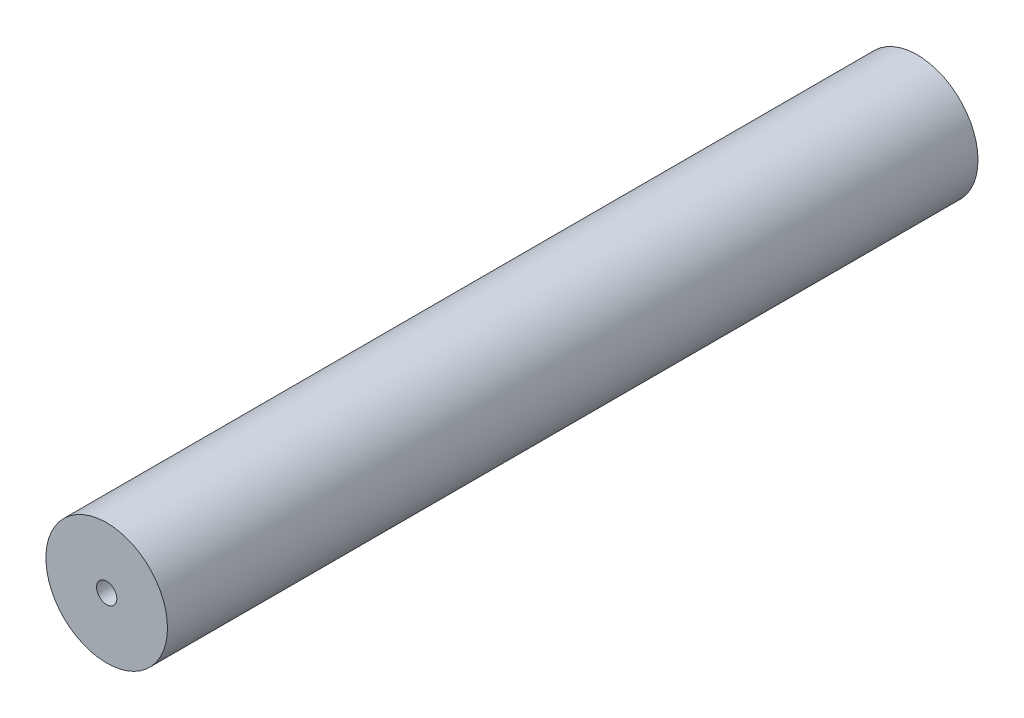
ISO-10303-21;
HEADER;
FILE_DESCRIPTION(('STEP AP214'),'2;1');
FILE_NAME('part.step','',(''),(''),'','','');
FILE_SCHEMA(('AUTOMOTIVE_DESIGN { 1 0 10303 214 1 1 1 1 }'));
ENDSEC;
DATA;
#1=APPLICATION_CONTEXT('core data for automotive mechanical design processes');
#2=APPLICATION_PROTOCOL_DEFINITION('international standard','automotive_design',2000,#1);
#3=PRODUCT_CONTEXT('',#1,'mechanical');
#4=PRODUCT('Part','Part','',(#3));
#5=PRODUCT_RELATED_PRODUCT_CATEGORY('part','',(#4));
#6=PRODUCT_DEFINITION_FORMATION('','',#4);
#7=PRODUCT_DEFINITION_CONTEXT('part definition',#1,'design');
#8=PRODUCT_DEFINITION('design','',#6,#7);
#9=PRODUCT_DEFINITION_SHAPE('','',#8);
#10=(LENGTH_UNIT() NAMED_UNIT(*) SI_UNIT(.MILLI.,.METRE.));
#11=(NAMED_UNIT(*) PLANE_ANGLE_UNIT() SI_UNIT($,.RADIAN.));
#12=(NAMED_UNIT(*) SI_UNIT($,.STERADIAN.) SOLID_ANGLE_UNIT());
#13=UNCERTAINTY_MEASURE_WITH_UNIT(LENGTH_MEASURE(1.E-05),#10,'distance_accuracy_value','');
#14=(GEOMETRIC_REPRESENTATION_CONTEXT(3) GLOBAL_UNCERTAINTY_ASSIGNED_CONTEXT((#13)) GLOBAL_UNIT_ASSIGNED_CONTEXT((#10,
#11,#12)) REPRESENTATION_CONTEXT('',''));
#15=CARTESIAN_POINT('',(0.,0.,0.));
#16=DIRECTION('',(0.,0.,1.));
#17=DIRECTION('',(1.,0.,0.));
#18=AXIS2_PLACEMENT_3D('',#15,#16,#17);
#19=CARTESIAN_POINT('',(0.,0.,508.));
#20=DIRECTION('',(0.,0.,1.));
#21=DIRECTION('',(1.,0.,0.));
#22=AXIS2_PLACEMENT_3D('',#19,#20,#21);
#23=PLANE('',#22);
#24=CARTESIAN_POINT('',(0.,0.,508.));
#25=DIRECTION('',(0.,0.,1.));
#26=DIRECTION('',(1.,0.,0.));
#27=AXIS2_PLACEMENT_3D('',#24,#25,#26);
#28=CIRCLE('',#27,38.1);
#29=CARTESIAN_POINT('',(38.1,0.,508.));
#30=VERTEX_POINT('',#29);
#31=EDGE_CURVE('E10',#30,#30,#28,.T.);
#32=ORIENTED_EDGE('',*,*,#31,.T.);
#33=EDGE_LOOP('',(#32));
#34=FACE_BOUND('',#33,.T.);
#35=CARTESIAN_POINT('',(0.,0.,508.));
#36=DIRECTION('',(0.,0.,1.));
#37=DIRECTION('',(1.,0.,0.));
#38=AXIS2_PLACEMENT_3D('',#35,#36,#37);
#39=CIRCLE('',#38,6.35);
#40=CARTESIAN_POINT('',(6.35,0.,508.));
#41=VERTEX_POINT('',#40);
#42=EDGE_CURVE('E50',#41,#41,#39,.T.);
#43=ORIENTED_EDGE('',*,*,#42,.F.);
#44=EDGE_LOOP('',(#43));
#45=FACE_BOUND('',#44,.T.);
#46=ADVANCED_FACE('F39',(#34,#45),#23,.T.);
#47=CARTESIAN_POINT('',(0.,0.,0.));
#48=DIRECTION('',(0.,0.,1.));
#49=DIRECTION('',(1.,0.,0.));
#50=AXIS2_PLACEMENT_3D('',#47,#48,#49);
#51=PLANE('',#50);
#52=CARTESIAN_POINT('',(0.,0.,0.));
#53=DIRECTION('',(0.,0.,1.));
#54=DIRECTION('',(1.,0.,0.));
#55=AXIS2_PLACEMENT_3D('',#52,#53,#54);
#56=CIRCLE('',#55,38.1);
#57=CARTESIAN_POINT('',(38.1,0.,0.));
#58=VERTEX_POINT('',#57);
#59=EDGE_CURVE('E43',#58,#58,#56,.T.);
#60=ORIENTED_EDGE('',*,*,#59,.F.);
#61=EDGE_LOOP('',(#60));
#62=FACE_BOUND('',#61,.T.);
#63=CARTESIAN_POINT('',(0.,0.,0.));
#64=DIRECTION('',(0.,0.,1.));
#65=DIRECTION('',(1.,0.,0.));
#66=AXIS2_PLACEMENT_3D('',#63,#64,#65);
#67=CIRCLE('',#66,6.35);
#68=CARTESIAN_POINT('',(6.35,0.,0.));
#69=VERTEX_POINT('',#68);
#70=EDGE_CURVE('E52',#69,#69,#67,.T.);
#71=ORIENTED_EDGE('',*,*,#70,.T.);
#72=EDGE_LOOP('',(#71));
#73=FACE_BOUND('',#72,.T.);
#74=ADVANCED_FACE('F62',(#62,#73),#51,.F.);
#75=CARTESIAN_POINT('',(0.,0.,508.));
#76=DIRECTION('',(0.,0.,-1.));
#77=DIRECTION('',(-1.,0.,0.));
#78=AXIS2_PLACEMENT_3D('',#75,#76,#77);
#79=CYLINDRICAL_SURFACE('',#78,38.1);
#80=ORIENTED_EDGE('',*,*,#31,.F.);
#81=EDGE_LOOP('',(#80));
#82=FACE_BOUND('',#81,.T.);
#83=ORIENTED_EDGE('',*,*,#59,.T.);
#84=EDGE_LOOP('',(#83));
#85=FACE_BOUND('',#84,.T.);
#86=ADVANCED_FACE('F41',(#82,#85),#79,.T.);
#87=CARTESIAN_POINT('',(0.,0.,508.));
#88=DIRECTION('',(0.,0.,-1.));
#89=DIRECTION('',(-1.,0.,0.));
#90=AXIS2_PLACEMENT_3D('',#87,#88,#89);
#91=CYLINDRICAL_SURFACE('',#90,6.35);
#92=ORIENTED_EDGE('',*,*,#42,.T.);
#93=EDGE_LOOP('',(#92));
#94=FACE_BOUND('',#93,.T.);
#95=ORIENTED_EDGE('',*,*,#70,.F.);
#96=EDGE_LOOP('',(#95));
#97=FACE_BOUND('',#96,.T.);
#98=ADVANCED_FACE('F58',(#94,#97),#91,.F.);
#99=CLOSED_SHELL('',(#46,#74,#86,#98));
#100=MANIFOLD_SOLID_BREP('B2',#99);
#101=ADVANCED_BREP_SHAPE_REPRESENTATION('',(#18,#100),#14);
#102=SHAPE_DEFINITION_REPRESENTATION(#9,#101);
ENDSEC;
END-ISO-10303-21;
